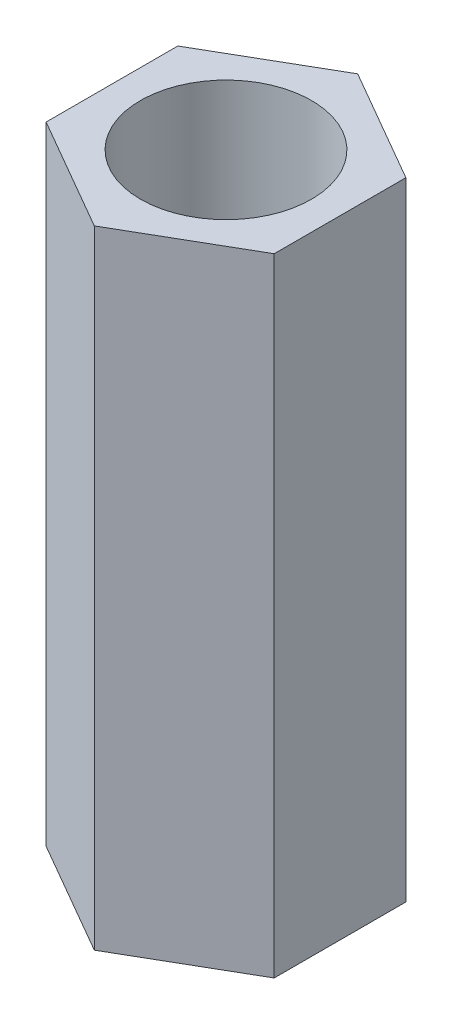
ISO-10303-21;
HEADER;
FILE_DESCRIPTION(('STEP AP214'),'2;1');
FILE_NAME('part.step','',(''),(''),'','','');
FILE_SCHEMA(('AUTOMOTIVE_DESIGN { 1 0 10303 214 1 1 1 1 }'));
ENDSEC;
DATA;
#1=APPLICATION_CONTEXT('core data for automotive mechanical design processes');
#2=APPLICATION_PROTOCOL_DEFINITION('international standard','automotive_design',2000,#1);
#3=PRODUCT_CONTEXT('',#1,'mechanical');
#4=PRODUCT('Part','Part','',(#3));
#5=PRODUCT_RELATED_PRODUCT_CATEGORY('part','',(#4));
#6=PRODUCT_DEFINITION_FORMATION('','',#4);
#7=PRODUCT_DEFINITION_CONTEXT('part definition',#1,'design');
#8=PRODUCT_DEFINITION('design','',#6,#7);
#9=PRODUCT_DEFINITION_SHAPE('','',#8);
#10=(LENGTH_UNIT() NAMED_UNIT(*) SI_UNIT(.MILLI.,.METRE.));
#11=(NAMED_UNIT(*) PLANE_ANGLE_UNIT() SI_UNIT($,.RADIAN.));
#12=(NAMED_UNIT(*) SI_UNIT($,.STERADIAN.) SOLID_ANGLE_UNIT());
#13=UNCERTAINTY_MEASURE_WITH_UNIT(LENGTH_MEASURE(1.E-05),#10,'distance_accuracy_value','');
#14=(GEOMETRIC_REPRESENTATION_CONTEXT(3) GLOBAL_UNCERTAINTY_ASSIGNED_CONTEXT((#13)) GLOBAL_UNIT_ASSIGNED_CONTEXT((#10,
#11,#12)) REPRESENTATION_CONTEXT('',''));
#15=CARTESIAN_POINT('',(0.,0.,0.));
#16=DIRECTION('',(0.,0.,1.));
#17=DIRECTION('',(1.,0.,0.));
#18=AXIS2_PLACEMENT_3D('',#15,#16,#17);
#19=CARTESIAN_POINT('',(0.,11.,0.));
#20=DIRECTION('',(0.,1.,0.));
#21=DIRECTION('',(0.,0.,1.));
#22=AXIS2_PLACEMENT_3D('',#19,#20,#21);
#23=PLANE('',#22);
#24=DIRECTION('',(-0.866025403784438,0.,-0.5));
#25=VECTOR('',#24,1.);
#26=CARTESIAN_POINT('',(2.,11.,-1.15470053837925));
#27=LINE('',#26,#25);
#28=CARTESIAN_POINT('',(2.,11.,-1.15470053837925));
#29=VERTEX_POINT('',#28);
#30=CARTESIAN_POINT('',(0.,11.,-2.3094010767585));
#31=VERTEX_POINT('',#30);
#32=EDGE_CURVE('E130',#29,#31,#27,.T.);
#33=ORIENTED_EDGE('',*,*,#32,.T.);
#34=DIRECTION('',(-0.866025403784439,0.,0.5));
#35=VECTOR('',#34,1.);
#36=CARTESIAN_POINT('',(0.,11.,-2.3094010767585));
#37=LINE('',#36,#35);
#38=CARTESIAN_POINT('',(-2.,11.,-1.15470053837925));
#39=VERTEX_POINT('',#38);
#40=EDGE_CURVE('E88',#31,#39,#37,.T.);
#41=ORIENTED_EDGE('',*,*,#40,.T.);
#42=DIRECTION('',(0.,0.,1.));
#43=VECTOR('',#42,1.);
#44=CARTESIAN_POINT('',(-2.,11.,-1.15470053837925));
#45=LINE('',#44,#43);
#46=CARTESIAN_POINT('',(-2.,11.,1.15470053837925));
#47=VERTEX_POINT('',#46);
#48=EDGE_CURVE('E101',#39,#47,#45,.T.);
#49=ORIENTED_EDGE('',*,*,#48,.T.);
#50=DIRECTION('',(0.866025403784439,0.,0.5));
#51=VECTOR('',#50,1.);
#52=CARTESIAN_POINT('',(-2.,11.,1.15470053837925));
#53=LINE('',#52,#51);
#54=CARTESIAN_POINT('',(0.,11.,2.3094010767585));
#55=VERTEX_POINT('',#54);
#56=EDGE_CURVE('E95',#47,#55,#53,.T.);
#57=ORIENTED_EDGE('',*,*,#56,.T.);
#58=DIRECTION('',(0.866025403784439,0.,-0.5));
#59=VECTOR('',#58,1.);
#60=CARTESIAN_POINT('',(0.,11.,2.3094010767585));
#61=LINE('',#60,#59);
#62=CARTESIAN_POINT('',(2.,11.,1.15470053837925));
#63=VERTEX_POINT('',#62);
#64=EDGE_CURVE('E99',#55,#63,#61,.T.);
#65=ORIENTED_EDGE('',*,*,#64,.T.);
#66=DIRECTION('',(0.,0.,-1.));
#67=VECTOR('',#66,1.);
#68=CARTESIAN_POINT('',(2.,11.,1.15470053837925));
#69=LINE('',#68,#67);
#70=EDGE_CURVE('E51',#63,#29,#69,.T.);
#71=ORIENTED_EDGE('',*,*,#70,.T.);
#72=EDGE_LOOP('',(#33,#41,#49,#57,#65,#71));
#73=FACE_BOUND('',#72,.T.);
#74=CARTESIAN_POINT('',(0.,11.,0.));
#75=DIRECTION('',(0.,1.,0.));
#76=DIRECTION('',(0.,0.,1.));
#77=AXIS2_PLACEMENT_3D('',#74,#75,#76);
#78=CIRCLE('',#77,1.5);
#79=CARTESIAN_POINT('',(0.,11.,1.5));
#80=VERTEX_POINT('',#79);
#81=EDGE_CURVE('E123',#80,#80,#78,.T.);
#82=ORIENTED_EDGE('',*,*,#81,.F.);
#83=EDGE_LOOP('',(#82));
#84=FACE_BOUND('',#83,.T.);
#85=ADVANCED_FACE('F34',(#73,#84),#23,.T.);
#86=CARTESIAN_POINT('',(0.,0.,0.));
#87=DIRECTION('',(0.,1.,0.));
#88=DIRECTION('',(0.,0.,1.));
#89=AXIS2_PLACEMENT_3D('',#86,#87,#88);
#90=PLANE('',#89);
#91=DIRECTION('',(-0.866025403784438,0.,-0.5));
#92=VECTOR('',#91,1.);
#93=CARTESIAN_POINT('',(2.,0.,-1.15470053837925));
#94=LINE('',#93,#92);
#95=CARTESIAN_POINT('',(2.,0.,-1.15470053837925));
#96=VERTEX_POINT('',#95);
#97=CARTESIAN_POINT('',(0.,0.,-2.3094010767585));
#98=VERTEX_POINT('',#97);
#99=EDGE_CURVE('E119',#96,#98,#94,.T.);
#100=ORIENTED_EDGE('',*,*,#99,.F.);
#101=DIRECTION('',(0.,0.,-1.));
#102=VECTOR('',#101,1.);
#103=CARTESIAN_POINT('',(2.,0.,1.15470053837925));
#104=LINE('',#103,#102);
#105=CARTESIAN_POINT('',(2.,0.,1.15470053837925));
#106=VERTEX_POINT('',#105);
#107=EDGE_CURVE('E80',#106,#96,#104,.T.);
#108=ORIENTED_EDGE('',*,*,#107,.F.);
#109=DIRECTION('',(0.866025403784439,0.,-0.5));
#110=VECTOR('',#109,1.);
#111=CARTESIAN_POINT('',(0.,0.,2.3094010767585));
#112=LINE('',#111,#110);
#113=CARTESIAN_POINT('',(0.,0.,2.3094010767585));
#114=VERTEX_POINT('',#113);
#115=EDGE_CURVE('E74',#114,#106,#112,.T.);
#116=ORIENTED_EDGE('',*,*,#115,.F.);
#117=DIRECTION('',(0.866025403784439,0.,0.5));
#118=VECTOR('',#117,1.);
#119=CARTESIAN_POINT('',(-2.,0.,1.15470053837925));
#120=LINE('',#119,#118);
#121=CARTESIAN_POINT('',(-2.,0.,1.15470053837925));
#122=VERTEX_POINT('',#121);
#123=EDGE_CURVE('E109',#122,#114,#120,.T.);
#124=ORIENTED_EDGE('',*,*,#123,.F.);
#125=DIRECTION('',(0.,0.,1.));
#126=VECTOR('',#125,1.);
#127=CARTESIAN_POINT('',(-2.,0.,-1.15470053837925));
#128=LINE('',#127,#126);
#129=CARTESIAN_POINT('',(-2.,0.,-1.15470053837925));
#130=VERTEX_POINT('',#129);
#131=EDGE_CURVE('E125',#130,#122,#128,.T.);
#132=ORIENTED_EDGE('',*,*,#131,.F.);
#133=DIRECTION('',(-0.866025403784439,0.,0.5));
#134=VECTOR('',#133,1.);
#135=CARTESIAN_POINT('',(0.,0.,-2.3094010767585));
#136=LINE('',#135,#134);
#137=EDGE_CURVE('E122',#98,#130,#136,.T.);
#138=ORIENTED_EDGE('',*,*,#137,.F.);
#139=EDGE_LOOP('',(#100,#108,#116,#124,#132,#138));
#140=FACE_BOUND('',#139,.T.);
#141=CARTESIAN_POINT('',(0.,0.,0.));
#142=DIRECTION('',(0.,1.,0.));
#143=DIRECTION('',(0.,0.,1.));
#144=AXIS2_PLACEMENT_3D('',#141,#142,#143);
#145=CIRCLE('',#144,1.5);
#146=CARTESIAN_POINT('',(0.,0.,1.5));
#147=VERTEX_POINT('',#146);
#148=EDGE_CURVE('E223',#147,#147,#145,.T.);
#149=ORIENTED_EDGE('',*,*,#148,.T.);
#150=EDGE_LOOP('',(#149));
#151=FACE_BOUND('',#150,.T.);
#152=ADVANCED_FACE('F139',(#140,#151),#90,.F.);
#153=CARTESIAN_POINT('',(2.,11.,-1.15470053837925));
#154=DIRECTION('',(-0.5,0.,0.866025403784439));
#155=DIRECTION('',(0.866025403784439,0.,0.5));
#156=AXIS2_PLACEMENT_3D('',#153,#154,#155);
#157=PLANE('',#156);
#158=ORIENTED_EDGE('',*,*,#99,.T.);
#159=DIRECTION('',(0.,-1.,0.));
#160=VECTOR('',#159,1.);
#161=CARTESIAN_POINT('',(0.,11.,-2.3094010767585));
#162=LINE('',#161,#160);
#163=EDGE_CURVE('E11',#31,#98,#162,.T.);
#164=ORIENTED_EDGE('',*,*,#163,.F.);
#165=ORIENTED_EDGE('',*,*,#32,.F.);
#166=DIRECTION('',(0.,-1.,0.));
#167=VECTOR('',#166,1.);
#168=CARTESIAN_POINT('',(2.,11.,-1.15470053837925));
#169=LINE('',#168,#167);
#170=EDGE_CURVE('E115',#29,#96,#169,.T.);
#171=ORIENTED_EDGE('',*,*,#170,.T.);
#172=EDGE_LOOP('',(#158,#164,#165,#171));
#173=FACE_BOUND('',#172,.T.);
#174=ADVANCED_FACE('F36',(#173),#157,.F.);
#175=CARTESIAN_POINT('',(0.,11.,-2.3094010767585));
#176=DIRECTION('',(0.5,0.,0.866025403784439));
#177=DIRECTION('',(0.866025403784439,0.,-0.5));
#178=AXIS2_PLACEMENT_3D('',#175,#176,#177);
#179=PLANE('',#178);
#180=ORIENTED_EDGE('',*,*,#137,.T.);
#181=DIRECTION('',(0.,-1.,0.));
#182=VECTOR('',#181,1.);
#183=CARTESIAN_POINT('',(-2.,11.,-1.15470053837925));
#184=LINE('',#183,#182);
#185=EDGE_CURVE('E43',#39,#130,#184,.T.);
#186=ORIENTED_EDGE('',*,*,#185,.F.);
#187=ORIENTED_EDGE('',*,*,#40,.F.);
#188=ORIENTED_EDGE('',*,*,#163,.T.);
#189=EDGE_LOOP('',(#180,#186,#187,#188));
#190=FACE_BOUND('',#189,.T.);
#191=ADVANCED_FACE('F164',(#190),#179,.F.);
#192=CARTESIAN_POINT('',(-2.,11.,-1.15470053837925));
#193=DIRECTION('',(1.,0.,0.));
#194=DIRECTION('',(0.,0.,-1.));
#195=AXIS2_PLACEMENT_3D('',#192,#193,#194);
#196=PLANE('',#195);
#197=ORIENTED_EDGE('',*,*,#131,.T.);
#198=DIRECTION('',(0.,-1.,0.));
#199=VECTOR('',#198,1.);
#200=CARTESIAN_POINT('',(-2.,11.,1.15470053837925));
#201=LINE('',#200,#199);
#202=EDGE_CURVE('E110',#47,#122,#201,.T.);
#203=ORIENTED_EDGE('',*,*,#202,.F.);
#204=ORIENTED_EDGE('',*,*,#48,.F.);
#205=ORIENTED_EDGE('',*,*,#185,.T.);
#206=EDGE_LOOP('',(#197,#203,#204,#205));
#207=FACE_BOUND('',#206,.T.);
#208=ADVANCED_FACE('F136',(#207),#196,.F.);
#209=CARTESIAN_POINT('',(-2.,11.,1.15470053837925));
#210=DIRECTION('',(0.5,0.,-0.866025403784439));
#211=DIRECTION('',(-0.866025403784439,0.,-0.5));
#212=AXIS2_PLACEMENT_3D('',#209,#210,#211);
#213=PLANE('',#212);
#214=ORIENTED_EDGE('',*,*,#123,.T.);
#215=DIRECTION('',(0.,-1.,0.));
#216=VECTOR('',#215,1.);
#217=CARTESIAN_POINT('',(0.,11.,2.3094010767585));
#218=LINE('',#217,#216);
#219=EDGE_CURVE('E106',#55,#114,#218,.T.);
#220=ORIENTED_EDGE('',*,*,#219,.F.);
#221=ORIENTED_EDGE('',*,*,#56,.F.);
#222=ORIENTED_EDGE('',*,*,#202,.T.);
#223=EDGE_LOOP('',(#214,#220,#221,#222));
#224=FACE_BOUND('',#223,.T.);
#225=ADVANCED_FACE('F107',(#224),#213,.F.);
#226=CARTESIAN_POINT('',(0.,11.,2.3094010767585));
#227=DIRECTION('',(-0.5,0.,-0.866025403784439));
#228=DIRECTION('',(-0.866025403784439,0.,0.5));
#229=AXIS2_PLACEMENT_3D('',#226,#227,#228);
#230=PLANE('',#229);
#231=ORIENTED_EDGE('',*,*,#115,.T.);
#232=DIRECTION('',(0.,-1.,0.));
#233=VECTOR('',#232,1.);
#234=CARTESIAN_POINT('',(2.,11.,1.15470053837925));
#235=LINE('',#234,#233);
#236=EDGE_CURVE('E111',#63,#106,#235,.T.);
#237=ORIENTED_EDGE('',*,*,#236,.F.);
#238=ORIENTED_EDGE('',*,*,#64,.F.);
#239=ORIENTED_EDGE('',*,*,#219,.T.);
#240=EDGE_LOOP('',(#231,#237,#238,#239));
#241=FACE_BOUND('',#240,.T.);
#242=ADVANCED_FACE('F113',(#241),#230,.F.);
#243=CARTESIAN_POINT('',(2.,11.,1.15470053837925));
#244=DIRECTION('',(-1.,0.,0.));
#245=DIRECTION('',(0.,0.,1.));
#246=AXIS2_PLACEMENT_3D('',#243,#244,#245);
#247=PLANE('',#246);
#248=ORIENTED_EDGE('',*,*,#107,.T.);
#249=ORIENTED_EDGE('',*,*,#170,.F.);
#250=ORIENTED_EDGE('',*,*,#70,.F.);
#251=ORIENTED_EDGE('',*,*,#236,.T.);
#252=EDGE_LOOP('',(#248,#249,#250,#251));
#253=FACE_BOUND('',#252,.T.);
#254=ADVANCED_FACE('F144',(#253),#247,.F.);
#255=CARTESIAN_POINT('',(0.,11.,0.));
#256=DIRECTION('',(0.,-1.,0.));
#257=DIRECTION('',(0.,0.,-1.));
#258=AXIS2_PLACEMENT_3D('',#255,#256,#257);
#259=CYLINDRICAL_SURFACE('',#258,1.5);
#260=ORIENTED_EDGE('',*,*,#81,.T.);
#261=EDGE_LOOP('',(#260));
#262=FACE_BOUND('',#261,.T.);
#263=ORIENTED_EDGE('',*,*,#148,.F.);
#264=EDGE_LOOP('',(#263));
#265=FACE_BOUND('',#264,.T.);
#266=ADVANCED_FACE('F146',(#262,#265),#259,.F.);
#267=CLOSED_SHELL('',(#85,#152,#174,#191,#208,#225,#242,#254,#266));
#268=MANIFOLD_SOLID_BREP('B2',#267);
#269=ADVANCED_BREP_SHAPE_REPRESENTATION('',(#18,#268),#14);
#270=SHAPE_DEFINITION_REPRESENTATION(#9,#269);
ENDSEC;
END-ISO-10303-21;
